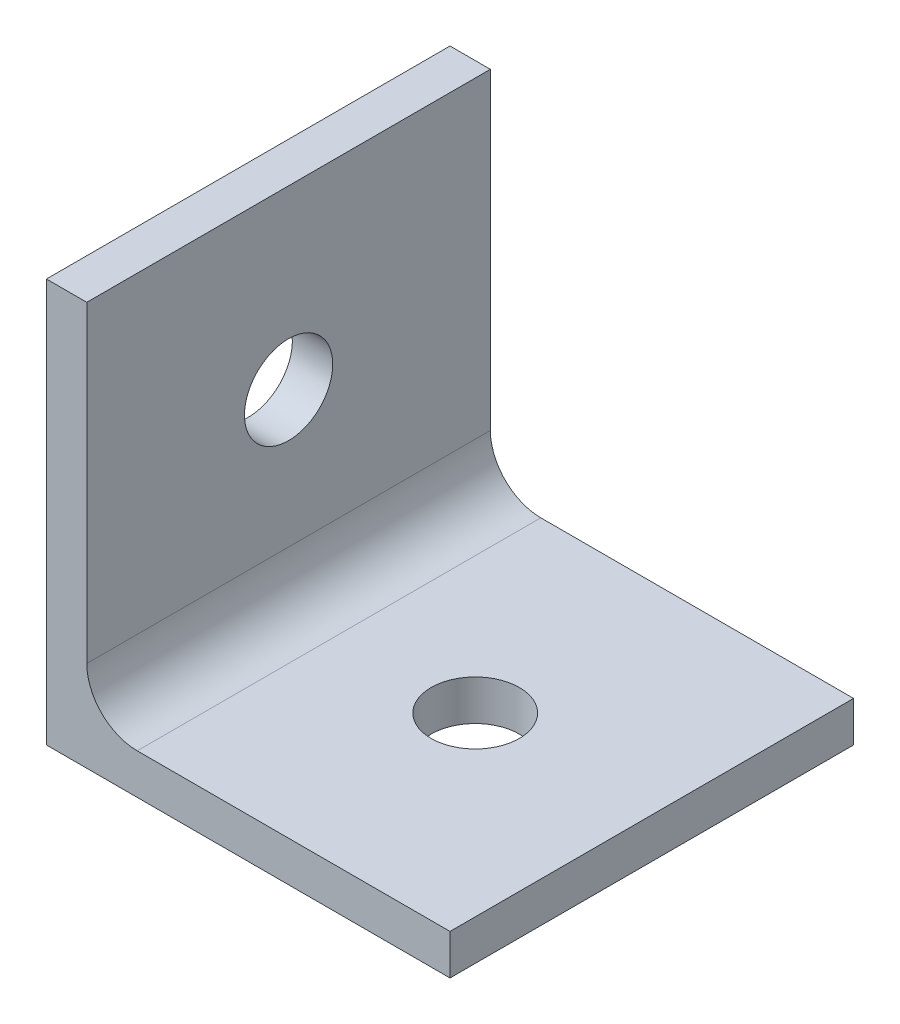
ISO-10303-21;
HEADER;
FILE_DESCRIPTION(('STEP AP214'),'2;1');
FILE_NAME('part.step','',(''),(''),'','','');
FILE_SCHEMA(('AUTOMOTIVE_DESIGN { 1 0 10303 214 1 1 1 1 }'));
ENDSEC;
DATA;
#1=APPLICATION_CONTEXT('core data for automotive mechanical design processes');
#2=APPLICATION_PROTOCOL_DEFINITION('international standard','automotive_design',2000,#1);
#3=PRODUCT_CONTEXT('',#1,'mechanical');
#4=PRODUCT('Part','Part','',(#3));
#5=PRODUCT_RELATED_PRODUCT_CATEGORY('part','',(#4));
#6=PRODUCT_DEFINITION_FORMATION('','',#4);
#7=PRODUCT_DEFINITION_CONTEXT('part definition',#1,'design');
#8=PRODUCT_DEFINITION('design','',#6,#7);
#9=PRODUCT_DEFINITION_SHAPE('','',#8);
#10=(LENGTH_UNIT() NAMED_UNIT(*) SI_UNIT(.MILLI.,.METRE.));
#11=(NAMED_UNIT(*) PLANE_ANGLE_UNIT() SI_UNIT($,.RADIAN.));
#12=(NAMED_UNIT(*) SI_UNIT($,.STERADIAN.) SOLID_ANGLE_UNIT());
#13=UNCERTAINTY_MEASURE_WITH_UNIT(LENGTH_MEASURE(1.E-05),#10,'distance_accuracy_value','');
#14=(GEOMETRIC_REPRESENTATION_CONTEXT(3) GLOBAL_UNCERTAINTY_ASSIGNED_CONTEXT((#13)) GLOBAL_UNIT_ASSIGNED_CONTEXT((#10,
#11,#12)) REPRESENTATION_CONTEXT('',''));
#15=CARTESIAN_POINT('',(0.,0.,0.));
#16=DIRECTION('',(0.,0.,1.));
#17=DIRECTION('',(1.,0.,0.));
#18=AXIS2_PLACEMENT_3D('',#15,#16,#17);
#19=CARTESIAN_POINT('',(0.,80.,40.));
#20=DIRECTION('',(1.,0.,0.));
#21=DIRECTION('',(0.,1.,0.));
#22=AXIS2_PLACEMENT_3D('',#19,#20,#21);
#23=PLANE('',#22);
#24=CARTESIAN_POINT('',(0.,45.,0.));
#25=DIRECTION('',(1.,0.,0.));
#26=DIRECTION('',(0.,1.,0.));
#27=AXIS2_PLACEMENT_3D('',#24,#25,#26);
#28=CIRCLE('',#27,8.75);
#29=CARTESIAN_POINT('',(0.,53.75,0.));
#30=VERTEX_POINT('',#29);
#31=EDGE_CURVE('E172',#30,#30,#28,.T.);
#32=ORIENTED_EDGE('',*,*,#31,.T.);
#33=EDGE_LOOP('',(#32));
#34=FACE_BOUND('',#33,.T.);
#35=DIRECTION('',(0.,-1.,0.));
#36=VECTOR('',#35,1.);
#37=CARTESIAN_POINT('',(0.,80.,-40.));
#38=LINE('',#37,#36);
#39=CARTESIAN_POINT('',(0.,80.,-40.));
#40=VERTEX_POINT('',#39);
#41=CARTESIAN_POINT('',(0.,0.,-40.));
#42=VERTEX_POINT('',#41);
#43=EDGE_CURVE('E133',#40,#42,#38,.T.);
#44=ORIENTED_EDGE('',*,*,#43,.T.);
#45=DIRECTION('',(0.,0.,-1.));
#46=VECTOR('',#45,1.);
#47=CARTESIAN_POINT('',(0.,0.,40.));
#48=LINE('',#47,#46);
#49=CARTESIAN_POINT('',(0.,0.,40.));
#50=VERTEX_POINT('',#49);
#51=EDGE_CURVE('E11',#50,#42,#48,.T.);
#52=ORIENTED_EDGE('',*,*,#51,.F.);
#53=DIRECTION('',(0.,-1.,0.));
#54=VECTOR('',#53,1.);
#55=CARTESIAN_POINT('',(0.,80.,40.));
#56=LINE('',#55,#54);
#57=CARTESIAN_POINT('',(0.,80.,40.));
#58=VERTEX_POINT('',#57);
#59=EDGE_CURVE('E146',#58,#50,#56,.T.);
#60=ORIENTED_EDGE('',*,*,#59,.F.);
#61=DIRECTION('',(0.,0.,-1.));
#62=VECTOR('',#61,1.);
#63=CARTESIAN_POINT('',(0.,80.,40.));
#64=LINE('',#63,#62);
#65=EDGE_CURVE('E129',#58,#40,#64,.T.);
#66=ORIENTED_EDGE('',*,*,#65,.T.);
#67=EDGE_LOOP('',(#44,#52,#60,#66));
#68=FACE_BOUND('',#67,.T.);
#69=ADVANCED_FACE('F43',(#34,#68),#23,.F.);
#70=CARTESIAN_POINT('',(0.,0.,40.));
#71=DIRECTION('',(0.,1.,0.));
#72=DIRECTION('',(0.,0.,1.));
#73=AXIS2_PLACEMENT_3D('',#70,#71,#72);
#74=PLANE('',#73);
#75=CARTESIAN_POINT('',(45.,0.,0.));
#76=DIRECTION('',(0.,1.,0.));
#77=DIRECTION('',(-1.,0.,0.));
#78=AXIS2_PLACEMENT_3D('',#75,#76,#77);
#79=CIRCLE('',#78,8.75);
#80=CARTESIAN_POINT('',(36.25,0.,0.));
#81=VERTEX_POINT('',#80);
#82=EDGE_CURVE('E137',#81,#81,#79,.T.);
#83=ORIENTED_EDGE('',*,*,#82,.T.);
#84=EDGE_LOOP('',(#83));
#85=FACE_BOUND('',#84,.T.);
#86=DIRECTION('',(1.,0.,0.));
#87=VECTOR('',#86,1.);
#88=CARTESIAN_POINT('',(0.,0.,-40.));
#89=LINE('',#88,#87);
#90=CARTESIAN_POINT('',(80.,0.,-40.));
#91=VERTEX_POINT('',#90);
#92=EDGE_CURVE('E136',#42,#91,#89,.T.);
#93=ORIENTED_EDGE('',*,*,#92,.T.);
#94=DIRECTION('',(0.,0.,-1.));
#95=VECTOR('',#94,1.);
#96=CARTESIAN_POINT('',(80.,0.,40.));
#97=LINE('',#96,#95);
#98=CARTESIAN_POINT('',(80.,0.,40.));
#99=VERTEX_POINT('',#98);
#100=EDGE_CURVE('E51',#99,#91,#97,.T.);
#101=ORIENTED_EDGE('',*,*,#100,.F.);
#102=DIRECTION('',(1.,0.,0.));
#103=VECTOR('',#102,1.);
#104=CARTESIAN_POINT('',(0.,0.,40.));
#105=LINE('',#104,#103);
#106=EDGE_CURVE('E99',#50,#99,#105,.T.);
#107=ORIENTED_EDGE('',*,*,#106,.F.);
#108=ORIENTED_EDGE('',*,*,#51,.T.);
#109=EDGE_LOOP('',(#93,#101,#107,#108));
#110=FACE_BOUND('',#109,.T.);
#111=ADVANCED_FACE('F200',(#85,#110),#74,.F.);
#112=CARTESIAN_POINT('',(80.,0.,40.));
#113=DIRECTION('',(-1.,0.,0.));
#114=DIRECTION('',(0.,0.,1.));
#115=AXIS2_PLACEMENT_3D('',#112,#113,#114);
#116=PLANE('',#115);
#117=DIRECTION('',(0.,1.,0.));
#118=VECTOR('',#117,1.);
#119=CARTESIAN_POINT('',(80.,0.,-40.));
#120=LINE('',#119,#118);
#121=CARTESIAN_POINT('',(80.,8.,-40.));
#122=VERTEX_POINT('',#121);
#123=EDGE_CURVE('E139',#91,#122,#120,.T.);
#124=ORIENTED_EDGE('',*,*,#123,.T.);
#125=DIRECTION('',(0.,0.,-1.));
#126=VECTOR('',#125,1.);
#127=CARTESIAN_POINT('',(80.,8.,40.));
#128=LINE('',#127,#126);
#129=CARTESIAN_POINT('',(80.,8.,40.));
#130=VERTEX_POINT('',#129);
#131=EDGE_CURVE('E150',#130,#122,#128,.T.);
#132=ORIENTED_EDGE('',*,*,#131,.F.);
#133=DIRECTION('',(0.,1.,0.));
#134=VECTOR('',#133,1.);
#135=CARTESIAN_POINT('',(80.,0.,40.));
#136=LINE('',#135,#134);
#137=EDGE_CURVE('E158',#99,#130,#136,.T.);
#138=ORIENTED_EDGE('',*,*,#137,.F.);
#139=ORIENTED_EDGE('',*,*,#100,.T.);
#140=EDGE_LOOP('',(#124,#132,#138,#139));
#141=FACE_BOUND('',#140,.T.);
#142=ADVANCED_FACE('F156',(#141),#116,.F.);
#143=CARTESIAN_POINT('',(80.,8.,40.));
#144=DIRECTION('',(0.,-1.,0.));
#145=DIRECTION('',(1.,0.,0.));
#146=AXIS2_PLACEMENT_3D('',#143,#144,#145);
#147=PLANE('',#146);
#148=CARTESIAN_POINT('',(45.,8.,0.));
#149=DIRECTION('',(0.,1.,0.));
#150=DIRECTION('',(-1.,0.,0.));
#151=AXIS2_PLACEMENT_3D('',#148,#149,#150);
#152=CIRCLE('',#151,8.75);
#153=CARTESIAN_POINT('',(36.25,7.99999999999999,0.));
#154=VERTEX_POINT('',#153);
#155=EDGE_CURVE('E169',#154,#154,#152,.T.);
#156=ORIENTED_EDGE('',*,*,#155,.F.);
#157=EDGE_LOOP('',(#156));
#158=FACE_BOUND('',#157,.T.);
#159=DIRECTION('',(-1.,0.,0.));
#160=VECTOR('',#159,1.);
#161=CARTESIAN_POINT('',(80.,8.,-40.));
#162=LINE('',#161,#160);
#163=CARTESIAN_POINT('',(18.0000000000001,7.99999999999999,-40.));
#164=VERTEX_POINT('',#163);
#165=EDGE_CURVE('E141',#122,#164,#162,.T.);
#166=ORIENTED_EDGE('',*,*,#165,.T.);
#167=DIRECTION('',(0.,0.,-1.));
#168=VECTOR('',#167,1.);
#169=CARTESIAN_POINT('',(18.0000000000001,7.99999999999999,40.));
#170=LINE('',#169,#168);
#171=CARTESIAN_POINT('',(18.0000000000001,7.99999999999999,40.));
#172=VERTEX_POINT('',#171);
#173=EDGE_CURVE('E124',#172,#164,#170,.T.);
#174=ORIENTED_EDGE('',*,*,#173,.F.);
#175=DIRECTION('',(-1.,0.,0.));
#176=VECTOR('',#175,1.);
#177=CARTESIAN_POINT('',(80.,8.,40.));
#178=LINE('',#177,#176);
#179=EDGE_CURVE('E115',#130,#172,#178,.T.);
#180=ORIENTED_EDGE('',*,*,#179,.F.);
#181=ORIENTED_EDGE('',*,*,#131,.T.);
#182=EDGE_LOOP('',(#166,#174,#180,#181));
#183=FACE_BOUND('',#182,.T.);
#184=ADVANCED_FACE('F164',(#158,#183),#147,.F.);
#185=CARTESIAN_POINT('',(18.,18.,40.));
#186=DIRECTION('',(0.,0.,-1.));
#187=DIRECTION('',(-1.,0.,0.));
#188=AXIS2_PLACEMENT_3D('',#185,#186,#187);
#189=CYLINDRICAL_SURFACE('',#188,10.);
#190=CARTESIAN_POINT('',(18.,18.,-40.));
#191=DIRECTION('',(0.,0.,-1.));
#192=DIRECTION('',(-1.,0.,0.));
#193=AXIS2_PLACEMENT_3D('',#190,#191,#192);
#194=CIRCLE('',#193,10.);
#195=CARTESIAN_POINT('',(8.,18.,-40.));
#196=VERTEX_POINT('',#195);
#197=EDGE_CURVE('E123',#164,#196,#194,.T.);
#198=ORIENTED_EDGE('',*,*,#197,.T.);
#199=DIRECTION('',(0.,0.,-1.));
#200=VECTOR('',#199,1.);
#201=CARTESIAN_POINT('',(8.,18.,40.));
#202=LINE('',#201,#200);
#203=CARTESIAN_POINT('',(8.,18.,40.));
#204=VERTEX_POINT('',#203);
#205=EDGE_CURVE('E120',#204,#196,#202,.T.);
#206=ORIENTED_EDGE('',*,*,#205,.F.);
#207=CARTESIAN_POINT('',(18.,18.,40.));
#208=DIRECTION('',(0.,0.,-1.));
#209=DIRECTION('',(-1.,0.,0.));
#210=AXIS2_PLACEMENT_3D('',#207,#208,#209);
#211=CIRCLE('',#210,10.);
#212=EDGE_CURVE('E109',#172,#204,#211,.T.);
#213=ORIENTED_EDGE('',*,*,#212,.F.);
#214=ORIENTED_EDGE('',*,*,#173,.T.);
#215=EDGE_LOOP('',(#198,#206,#213,#214));
#216=FACE_BOUND('',#215,.T.);
#217=ADVANCED_FACE('F121',(#216),#189,.F.);
#218=CARTESIAN_POINT('',(7.99999999999999,18.0000000000001,40.));
#219=DIRECTION('',(-1.,0.,0.));
#220=DIRECTION('',(0.,-1.,0.));
#221=AXIS2_PLACEMENT_3D('',#218,#219,#220);
#222=PLANE('',#221);
#223=CARTESIAN_POINT('',(8.,45.,0.));
#224=DIRECTION('',(1.,0.,0.));
#225=DIRECTION('',(0.,1.,0.));
#226=AXIS2_PLACEMENT_3D('',#223,#224,#225);
#227=CIRCLE('',#226,8.75);
#228=CARTESIAN_POINT('',(8.,53.75,0.));
#229=VERTEX_POINT('',#228);
#230=EDGE_CURVE('E175',#229,#229,#227,.T.);
#231=ORIENTED_EDGE('',*,*,#230,.F.);
#232=EDGE_LOOP('',(#231));
#233=FACE_BOUND('',#232,.T.);
#234=DIRECTION('',(0.,1.,0.));
#235=VECTOR('',#234,1.);
#236=CARTESIAN_POINT('',(7.99999999999999,18.0000000000001,-40.));
#237=LINE('',#236,#235);
#238=CARTESIAN_POINT('',(8.,80.,-40.));
#239=VERTEX_POINT('',#238);
#240=EDGE_CURVE('E85',#196,#239,#237,.T.);
#241=ORIENTED_EDGE('',*,*,#240,.T.);
#242=DIRECTION('',(0.,0.,-1.));
#243=VECTOR('',#242,1.);
#244=CARTESIAN_POINT('',(8.,80.,40.));
#245=LINE('',#244,#243);
#246=CARTESIAN_POINT('',(8.,80.,40.));
#247=VERTEX_POINT('',#246);
#248=EDGE_CURVE('E125',#247,#239,#245,.T.);
#249=ORIENTED_EDGE('',*,*,#248,.F.);
#250=DIRECTION('',(0.,1.,0.));
#251=VECTOR('',#250,1.);
#252=CARTESIAN_POINT('',(7.99999999999999,18.0000000000001,40.));
#253=LINE('',#252,#251);
#254=EDGE_CURVE('E113',#204,#247,#253,.T.);
#255=ORIENTED_EDGE('',*,*,#254,.F.);
#256=ORIENTED_EDGE('',*,*,#205,.T.);
#257=EDGE_LOOP('',(#241,#249,#255,#256));
#258=FACE_BOUND('',#257,.T.);
#259=ADVANCED_FACE('F127',(#233,#258),#222,.F.);
#260=CARTESIAN_POINT('',(8.,80.,40.));
#261=DIRECTION('',(0.,-1.,0.));
#262=DIRECTION('',(0.,0.,-1.));
#263=AXIS2_PLACEMENT_3D('',#260,#261,#262);
#264=PLANE('',#263);
#265=DIRECTION('',(-1.,0.,0.));
#266=VECTOR('',#265,1.);
#267=CARTESIAN_POINT('',(8.,80.,-40.));
#268=LINE('',#267,#266);
#269=EDGE_CURVE('E91',#239,#40,#268,.T.);
#270=ORIENTED_EDGE('',*,*,#269,.T.);
#271=ORIENTED_EDGE('',*,*,#65,.F.);
#272=DIRECTION('',(-1.,0.,0.));
#273=VECTOR('',#272,1.);
#274=CARTESIAN_POINT('',(8.,80.,40.));
#275=LINE('',#274,#273);
#276=EDGE_CURVE('E59',#247,#58,#275,.T.);
#277=ORIENTED_EDGE('',*,*,#276,.F.);
#278=ORIENTED_EDGE('',*,*,#248,.T.);
#279=EDGE_LOOP('',(#270,#271,#277,#278));
#280=FACE_BOUND('',#279,.T.);
#281=ADVANCED_FACE('F191',(#280),#264,.F.);
#282=CARTESIAN_POINT('',(18.,18.,40.));
#283=DIRECTION('',(0.,0.,-1.));
#284=DIRECTION('',(-1.,0.,0.));
#285=AXIS2_PLACEMENT_3D('',#282,#283,#284);
#286=PLANE('',#285);
#287=ORIENTED_EDGE('',*,*,#59,.T.);
#288=ORIENTED_EDGE('',*,*,#106,.T.);
#289=ORIENTED_EDGE('',*,*,#137,.T.);
#290=ORIENTED_EDGE('',*,*,#179,.T.);
#291=ORIENTED_EDGE('',*,*,#212,.T.);
#292=ORIENTED_EDGE('',*,*,#254,.T.);
#293=ORIENTED_EDGE('',*,*,#276,.T.);
#294=EDGE_LOOP('',(#287,#288,#289,#290,#291,#292,#293));
#295=FACE_BOUND('',#294,.T.);
#296=ADVANCED_FACE('F111',(#295),#286,.F.);
#297=CARTESIAN_POINT('',(18.,18.,-40.));
#298=DIRECTION('',(0.,0.,-1.));
#299=DIRECTION('',(-1.,0.,0.));
#300=AXIS2_PLACEMENT_3D('',#297,#298,#299);
#301=PLANE('',#300);
#302=ORIENTED_EDGE('',*,*,#43,.F.);
#303=ORIENTED_EDGE('',*,*,#269,.F.);
#304=ORIENTED_EDGE('',*,*,#240,.F.);
#305=ORIENTED_EDGE('',*,*,#197,.F.);
#306=ORIENTED_EDGE('',*,*,#165,.F.);
#307=ORIENTED_EDGE('',*,*,#123,.F.);
#308=ORIENTED_EDGE('',*,*,#92,.F.);
#309=EDGE_LOOP('',(#302,#303,#304,#305,#306,#307,#308));
#310=FACE_BOUND('',#309,.T.);
#311=ADVANCED_FACE('F162',(#310),#301,.T.);
#312=CARTESIAN_POINT('',(45.,0.,0.));
#313=DIRECTION('',(0.,1.,0.));
#314=DIRECTION('',(-1.,0.,0.));
#315=AXIS2_PLACEMENT_3D('',#312,#313,#314);
#316=CYLINDRICAL_SURFACE('',#315,8.75);
#317=ORIENTED_EDGE('',*,*,#82,.F.);
#318=EDGE_LOOP('',(#317));
#319=FACE_BOUND('',#318,.T.);
#320=ORIENTED_EDGE('',*,*,#155,.T.);
#321=EDGE_LOOP('',(#320));
#322=FACE_BOUND('',#321,.T.);
#323=ADVANCED_FACE('F186',(#319,#322),#316,.F.);
#324=CARTESIAN_POINT('',(0.,45.,0.));
#325=DIRECTION('',(1.,0.,0.));
#326=DIRECTION('',(0.,1.,0.));
#327=AXIS2_PLACEMENT_3D('',#324,#325,#326);
#328=CYLINDRICAL_SURFACE('',#327,8.75);
#329=ORIENTED_EDGE('',*,*,#31,.F.);
#330=EDGE_LOOP('',(#329));
#331=FACE_BOUND('',#330,.T.);
#332=ORIENTED_EDGE('',*,*,#230,.T.);
#333=EDGE_LOOP('',(#332));
#334=FACE_BOUND('',#333,.T.);
#335=ADVANCED_FACE('F183',(#331,#334),#328,.F.);
#336=CLOSED_SHELL('',(#69,#111,#142,#184,#217,#259,#281,#296,#311,#323,#335));
#337=MANIFOLD_SOLID_BREP('B2',#336);
#338=ADVANCED_BREP_SHAPE_REPRESENTATION('',(#18,#337),#14);
#339=SHAPE_DEFINITION_REPRESENTATION(#9,#338);
ENDSEC;
END-ISO-10303-21;
